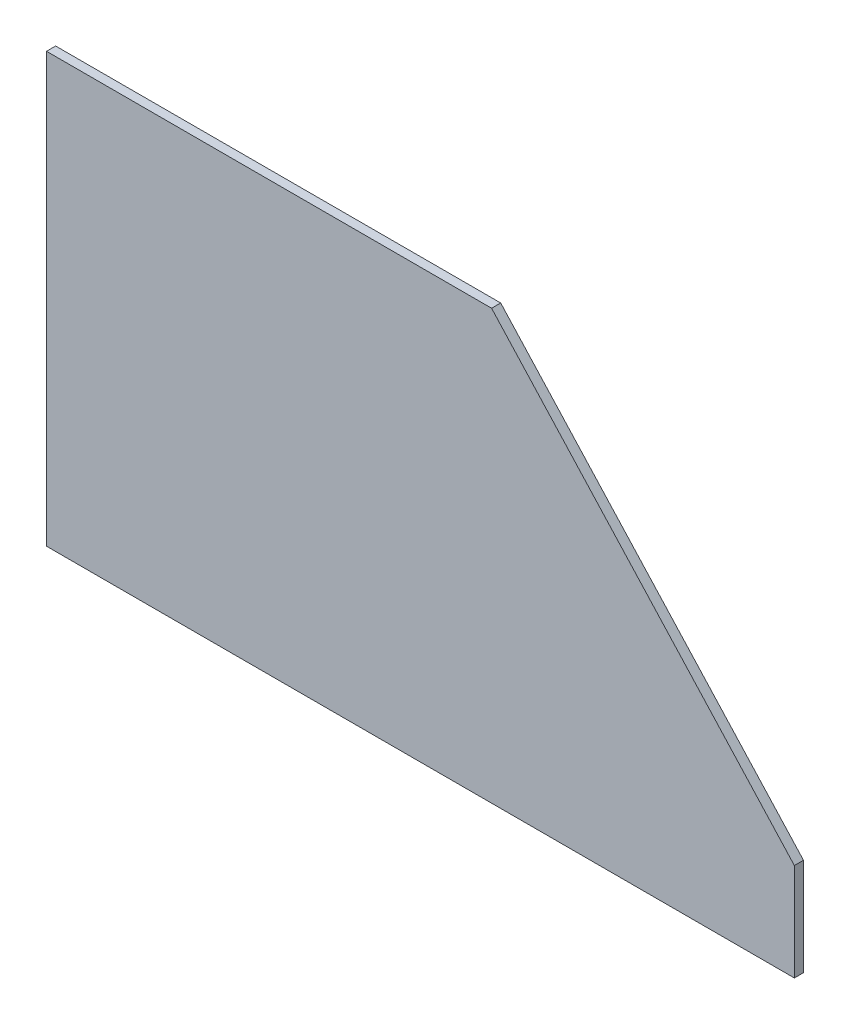
ISO-10303-21;
HEADER;
FILE_DESCRIPTION(('STEP AP214'),'2;1');
FILE_NAME('part.step','',(''),(''),'','','');
FILE_SCHEMA(('AUTOMOTIVE_DESIGN { 1 0 10303 214 1 1 1 1 }'));
ENDSEC;
DATA;
#1=APPLICATION_CONTEXT('core data for automotive mechanical design processes');
#2=APPLICATION_PROTOCOL_DEFINITION('international standard','automotive_design',2000,#1);
#3=PRODUCT_CONTEXT('',#1,'mechanical');
#4=PRODUCT('Part','Part','',(#3));
#5=PRODUCT_RELATED_PRODUCT_CATEGORY('part','',(#4));
#6=PRODUCT_DEFINITION_FORMATION('','',#4);
#7=PRODUCT_DEFINITION_CONTEXT('part definition',#1,'design');
#8=PRODUCT_DEFINITION('design','',#6,#7);
#9=PRODUCT_DEFINITION_SHAPE('','',#8);
#10=(LENGTH_UNIT() NAMED_UNIT(*) SI_UNIT(.MILLI.,.METRE.));
#11=(NAMED_UNIT(*) PLANE_ANGLE_UNIT() SI_UNIT($,.RADIAN.));
#12=(NAMED_UNIT(*) SI_UNIT($,.STERADIAN.) SOLID_ANGLE_UNIT());
#13=UNCERTAINTY_MEASURE_WITH_UNIT(LENGTH_MEASURE(1.E-05),#10,'distance_accuracy_value','');
#14=(GEOMETRIC_REPRESENTATION_CONTEXT(3) GLOBAL_UNCERTAINTY_ASSIGNED_CONTEXT((#13)) GLOBAL_UNIT_ASSIGNED_CONTEXT((#10,
#11,#12)) REPRESENTATION_CONTEXT('',''));
#15=CARTESIAN_POINT('',(0.,0.,0.));
#16=DIRECTION('',(0.,0.,1.));
#17=DIRECTION('',(1.,0.,0.));
#18=AXIS2_PLACEMENT_3D('',#15,#16,#17);
#19=CARTESIAN_POINT('',(0.,298.45,6.35));
#20=DIRECTION('',(1.,0.,0.));
#21=DIRECTION('',(0.,1.,0.));
#22=AXIS2_PLACEMENT_3D('',#19,#20,#21);
#23=PLANE('',#22);
#24=DIRECTION('',(0.,-1.,0.));
#25=VECTOR('',#24,1.);
#26=CARTESIAN_POINT('',(0.,298.45,0.));
#27=LINE('',#26,#25);
#28=CARTESIAN_POINT('',(0.,298.45,0.));
#29=VERTEX_POINT('',#28);
#30=CARTESIAN_POINT('',(0.,0.,0.));
#31=VERTEX_POINT('',#30);
#32=EDGE_CURVE('E107',#29,#31,#27,.T.);
#33=ORIENTED_EDGE('',*,*,#32,.T.);
#34=DIRECTION('',(0.,0.,-1.));
#35=VECTOR('',#34,1.);
#36=CARTESIAN_POINT('',(0.,0.,6.35));
#37=LINE('',#36,#35);
#38=CARTESIAN_POINT('',(0.,0.,6.35));
#39=VERTEX_POINT('',#38);
#40=EDGE_CURVE('E11',#39,#31,#37,.T.);
#41=ORIENTED_EDGE('',*,*,#40,.F.);
#42=DIRECTION('',(0.,-1.,0.));
#43=VECTOR('',#42,1.);
#44=CARTESIAN_POINT('',(0.,298.45,6.35));
#45=LINE('',#44,#43);
#46=CARTESIAN_POINT('',(0.,298.45,6.35));
#47=VERTEX_POINT('',#46);
#48=EDGE_CURVE('E115',#47,#39,#45,.T.);
#49=ORIENTED_EDGE('',*,*,#48,.F.);
#50=DIRECTION('',(0.,0.,-1.));
#51=VECTOR('',#50,1.);
#52=CARTESIAN_POINT('',(0.,298.45,6.35));
#53=LINE('',#52,#51);
#54=EDGE_CURVE('E103',#47,#29,#53,.T.);
#55=ORIENTED_EDGE('',*,*,#54,.T.);
#56=EDGE_LOOP('',(#33,#41,#49,#55));
#57=FACE_BOUND('',#56,.T.);
#58=ADVANCED_FACE('F33',(#57),#23,.F.);
#59=CARTESIAN_POINT('',(0.,0.,6.35));
#60=DIRECTION('',(0.,1.,0.));
#61=DIRECTION('',(0.,0.,1.));
#62=AXIS2_PLACEMENT_3D('',#59,#60,#61);
#63=PLANE('',#62);
#64=DIRECTION('',(1.,0.,0.));
#65=VECTOR('',#64,1.);
#66=CARTESIAN_POINT('',(0.,0.,0.));
#67=LINE('',#66,#65);
#68=CARTESIAN_POINT('',(520.7,0.,0.));
#69=VERTEX_POINT('',#68);
#70=EDGE_CURVE('E110',#31,#69,#67,.T.);
#71=ORIENTED_EDGE('',*,*,#70,.T.);
#72=DIRECTION('',(0.,0.,-1.));
#73=VECTOR('',#72,1.);
#74=CARTESIAN_POINT('',(520.7,0.,6.35));
#75=LINE('',#74,#73);
#76=CARTESIAN_POINT('',(520.7,0.,6.35));
#77=VERTEX_POINT('',#76);
#78=EDGE_CURVE('E41',#77,#69,#75,.T.);
#79=ORIENTED_EDGE('',*,*,#78,.F.);
#80=DIRECTION('',(1.,0.,0.));
#81=VECTOR('',#80,1.);
#82=CARTESIAN_POINT('',(0.,0.,6.35));
#83=LINE('',#82,#81);
#84=EDGE_CURVE('E83',#39,#77,#83,.T.);
#85=ORIENTED_EDGE('',*,*,#84,.F.);
#86=ORIENTED_EDGE('',*,*,#40,.T.);
#87=EDGE_LOOP('',(#71,#79,#85,#86));
#88=FACE_BOUND('',#87,.T.);
#89=ADVANCED_FACE('F134',(#88),#63,.F.);
#90=CARTESIAN_POINT('',(520.7,0.,6.35));
#91=DIRECTION('',(-1.,0.,0.));
#92=DIRECTION('',(0.,0.,1.));
#93=AXIS2_PLACEMENT_3D('',#90,#91,#92);
#94=PLANE('',#93);
#95=DIRECTION('',(0.,1.,0.));
#96=VECTOR('',#95,1.);
#97=CARTESIAN_POINT('',(520.7,0.,0.));
#98=LINE('',#97,#96);
#99=CARTESIAN_POINT('',(520.7,67.818,0.));
#100=VERTEX_POINT('',#99);
#101=EDGE_CURVE('E98',#69,#100,#98,.T.);
#102=ORIENTED_EDGE('',*,*,#101,.T.);
#103=DIRECTION('',(0.,0.,-1.));
#104=VECTOR('',#103,1.);
#105=CARTESIAN_POINT('',(520.7,67.818,6.35));
#106=LINE('',#105,#104);
#107=CARTESIAN_POINT('',(520.7,67.818,6.35));
#108=VERTEX_POINT('',#107);
#109=EDGE_CURVE('E95',#108,#100,#106,.T.);
#110=ORIENTED_EDGE('',*,*,#109,.F.);
#111=DIRECTION('',(0.,1.,0.));
#112=VECTOR('',#111,1.);
#113=CARTESIAN_POINT('',(520.7,0.,6.35));
#114=LINE('',#113,#112);
#115=EDGE_CURVE('E87',#77,#108,#114,.T.);
#116=ORIENTED_EDGE('',*,*,#115,.F.);
#117=ORIENTED_EDGE('',*,*,#78,.T.);
#118=EDGE_LOOP('',(#102,#110,#116,#117));
#119=FACE_BOUND('',#118,.T.);
#120=ADVANCED_FACE('F96',(#119),#94,.F.);
#121=CARTESIAN_POINT('',(520.7,67.818,6.35));
#122=DIRECTION('',(-0.738098204999656,-0.674693293116425,0.));
#123=DIRECTION('',(0.674693293116425,-0.738098204999656,0.));
#124=AXIS2_PLACEMENT_3D('',#121,#122,#123);
#125=PLANE('',#124);
#126=DIRECTION('',(-0.674693293116425,0.738098204999656,0.));
#127=VECTOR('',#126,1.);
#128=CARTESIAN_POINT('',(520.7,67.818,0.));
#129=LINE('',#128,#127);
#130=CARTESIAN_POINT('',(309.88,298.45,0.));
#131=VERTEX_POINT('',#130);
#132=EDGE_CURVE('E69',#100,#131,#129,.T.);
#133=ORIENTED_EDGE('',*,*,#132,.T.);
#134=DIRECTION('',(0.,0.,-1.));
#135=VECTOR('',#134,1.);
#136=CARTESIAN_POINT('',(309.88,298.45,6.35));
#137=LINE('',#136,#135);
#138=CARTESIAN_POINT('',(309.88,298.45,6.35));
#139=VERTEX_POINT('',#138);
#140=EDGE_CURVE('E99',#139,#131,#137,.T.);
#141=ORIENTED_EDGE('',*,*,#140,.F.);
#142=DIRECTION('',(-0.674693293116425,0.738098204999656,0.));
#143=VECTOR('',#142,1.);
#144=CARTESIAN_POINT('',(520.7,67.818,6.35));
#145=LINE('',#144,#143);
#146=EDGE_CURVE('E91',#108,#139,#145,.T.);
#147=ORIENTED_EDGE('',*,*,#146,.F.);
#148=ORIENTED_EDGE('',*,*,#109,.T.);
#149=EDGE_LOOP('',(#133,#141,#147,#148));
#150=FACE_BOUND('',#149,.T.);
#151=ADVANCED_FACE('F101',(#150),#125,.F.);
#152=CARTESIAN_POINT('',(309.88,298.45,6.35));
#153=DIRECTION('',(0.,-1.,0.));
#154=DIRECTION('',(1.,0.,0.));
#155=AXIS2_PLACEMENT_3D('',#152,#153,#154);
#156=PLANE('',#155);
#157=DIRECTION('',(-1.,0.,0.));
#158=VECTOR('',#157,1.);
#159=CARTESIAN_POINT('',(309.88,298.45,0.));
#160=LINE('',#159,#158);
#161=EDGE_CURVE('E75',#131,#29,#160,.T.);
#162=ORIENTED_EDGE('',*,*,#161,.T.);
#163=ORIENTED_EDGE('',*,*,#54,.F.);
#164=DIRECTION('',(-1.,0.,0.));
#165=VECTOR('',#164,1.);
#166=CARTESIAN_POINT('',(309.88,298.45,6.35));
#167=LINE('',#166,#165);
#168=EDGE_CURVE('E49',#139,#47,#167,.T.);
#169=ORIENTED_EDGE('',*,*,#168,.F.);
#170=ORIENTED_EDGE('',*,*,#140,.T.);
#171=EDGE_LOOP('',(#162,#163,#169,#170));
#172=FACE_BOUND('',#171,.T.);
#173=ADVANCED_FACE('F123',(#172),#156,.F.);
#174=CARTESIAN_POINT('',(0.,0.,6.35));
#175=DIRECTION('',(0.,0.,1.));
#176=DIRECTION('',(1.,0.,0.));
#177=AXIS2_PLACEMENT_3D('',#174,#175,#176);
#178=PLANE('',#177);
#179=ORIENTED_EDGE('',*,*,#48,.T.);
#180=ORIENTED_EDGE('',*,*,#84,.T.);
#181=ORIENTED_EDGE('',*,*,#115,.T.);
#182=ORIENTED_EDGE('',*,*,#146,.T.);
#183=ORIENTED_EDGE('',*,*,#168,.T.);
#184=EDGE_LOOP('',(#179,#180,#181,#182,#183));
#185=FACE_BOUND('',#184,.T.);
#186=ADVANCED_FACE('F89',(#185),#178,.T.);
#187=CARTESIAN_POINT('',(0.,0.,0.));
#188=DIRECTION('',(0.,0.,1.));
#189=DIRECTION('',(1.,0.,0.));
#190=AXIS2_PLACEMENT_3D('',#187,#188,#189);
#191=PLANE('',#190);
#192=ORIENTED_EDGE('',*,*,#32,.F.);
#193=ORIENTED_EDGE('',*,*,#161,.F.);
#194=ORIENTED_EDGE('',*,*,#132,.F.);
#195=ORIENTED_EDGE('',*,*,#101,.F.);
#196=ORIENTED_EDGE('',*,*,#70,.F.);
#197=EDGE_LOOP('',(#192,#193,#194,#195,#196));
#198=FACE_BOUND('',#197,.T.);
#199=ADVANCED_FACE('F119',(#198),#191,.F.);
#200=CLOSED_SHELL('',(#58,#89,#120,#151,#173,#186,#199));
#201=MANIFOLD_SOLID_BREP('B2',#200);
#202=ADVANCED_BREP_SHAPE_REPRESENTATION('',(#18,#201),#14);
#203=SHAPE_DEFINITION_REPRESENTATION(#9,#202);
ENDSEC;
END-ISO-10303-21;
